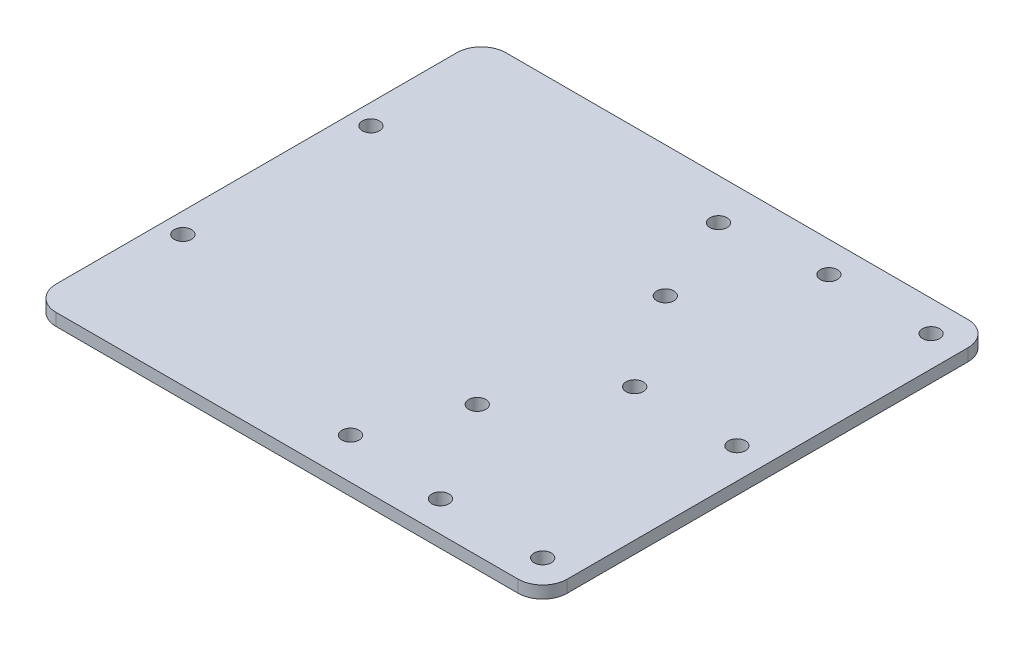
ISO-10303-21;
HEADER;
FILE_DESCRIPTION(('STEP AP214'),'2;1');
FILE_NAME('part.step','',(''),(''),'','','');
FILE_SCHEMA(('AUTOMOTIVE_DESIGN { 1 0 10303 214 1 1 1 1 }'));
ENDSEC;
DATA;
#1=APPLICATION_CONTEXT('core data for automotive mechanical design processes');
#2=APPLICATION_PROTOCOL_DEFINITION('international standard','automotive_design',2000,#1);
#3=PRODUCT_CONTEXT('',#1,'mechanical');
#4=PRODUCT('Part','Part','',(#3));
#5=PRODUCT_RELATED_PRODUCT_CATEGORY('part','',(#4));
#6=PRODUCT_DEFINITION_FORMATION('','',#4);
#7=PRODUCT_DEFINITION_CONTEXT('part definition',#1,'design');
#8=PRODUCT_DEFINITION('design','',#6,#7);
#9=PRODUCT_DEFINITION_SHAPE('','',#8);
#10=(LENGTH_UNIT() NAMED_UNIT(*) SI_UNIT(.MILLI.,.METRE.));
#11=(NAMED_UNIT(*) PLANE_ANGLE_UNIT() SI_UNIT($,.RADIAN.));
#12=(NAMED_UNIT(*) SI_UNIT($,.STERADIAN.) SOLID_ANGLE_UNIT());
#13=UNCERTAINTY_MEASURE_WITH_UNIT(LENGTH_MEASURE(1.E-05),#10,'distance_accuracy_value','');
#14=(GEOMETRIC_REPRESENTATION_CONTEXT(3) GLOBAL_UNCERTAINTY_ASSIGNED_CONTEXT((#13)) GLOBAL_UNIT_ASSIGNED_CONTEXT((#10,
#11,#12)) REPRESENTATION_CONTEXT('',''));
#15=CARTESIAN_POINT('',(0.,0.,0.));
#16=DIRECTION('',(0.,0.,1.));
#17=DIRECTION('',(1.,0.,0.));
#18=AXIS2_PLACEMENT_3D('',#15,#16,#17);
#19=CARTESIAN_POINT('',(9.21175578652743,3.,55.8895277814332));
#20=DIRECTION('',(0.,-1.,0.));
#21=DIRECTION('',(0.,0.,-1.));
#22=AXIS2_PLACEMENT_3D('',#19,#20,#21);
#23=CYLINDRICAL_SURFACE('',#22,6.);
#24=CARTESIAN_POINT('',(9.21175578652743,0.,55.8895277814332));
#25=DIRECTION('',(0.,1.,0.));
#26=DIRECTION('',(0.,0.,-1.));
#27=AXIS2_PLACEMENT_3D('',#24,#25,#26);
#28=CIRCLE('',#27,6.);
#29=CARTESIAN_POINT('',(9.21175578652743,0.,61.8895277814332));
#30=VERTEX_POINT('',#29);
#31=CARTESIAN_POINT('',(15.2117557865274,0.,55.8895277814332));
#32=VERTEX_POINT('',#31);
#33=EDGE_CURVE('E130',#30,#32,#28,.T.);
#34=ORIENTED_EDGE('',*,*,#33,.T.);
#35=DIRECTION('',(0.,-1.,0.));
#36=VECTOR('',#35,1.);
#37=CARTESIAN_POINT('',(15.2117557865274,3.,55.8895277814332));
#38=LINE('',#37,#36);
#39=CARTESIAN_POINT('',(15.2117557865274,3.,55.8895277814332));
#40=VERTEX_POINT('',#39);
#41=EDGE_CURVE('E11',#40,#32,#38,.T.);
#42=ORIENTED_EDGE('',*,*,#41,.F.);
#43=CARTESIAN_POINT('',(9.21175578652743,3.,55.8895277814332));
#44=DIRECTION('',(0.,1.,0.));
#45=DIRECTION('',(0.,0.,-1.));
#46=AXIS2_PLACEMENT_3D('',#43,#44,#45);
#47=CIRCLE('',#46,6.);
#48=CARTESIAN_POINT('',(9.21175578652743,3.,61.8895277814332));
#49=VERTEX_POINT('',#48);
#50=EDGE_CURVE('E145',#49,#40,#47,.T.);
#51=ORIENTED_EDGE('',*,*,#50,.F.);
#52=DIRECTION('',(0.,-1.,0.));
#53=VECTOR('',#52,1.);
#54=CARTESIAN_POINT('',(9.21175578652743,3.,61.8895277814332));
#55=LINE('',#54,#53);
#56=EDGE_CURVE('E126',#49,#30,#55,.T.);
#57=ORIENTED_EDGE('',*,*,#56,.T.);
#58=EDGE_LOOP('',(#34,#42,#51,#57));
#59=FACE_BOUND('',#58,.T.);
#60=ADVANCED_FACE('F34',(#59),#23,.T.);
#61=CARTESIAN_POINT('',(15.2117557865274,3.,55.8895277814332));
#62=DIRECTION('',(-1.,0.,0.));
#63=DIRECTION('',(0.,0.,1.));
#64=AXIS2_PLACEMENT_3D('',#61,#62,#63);
#65=PLANE('',#64);
#66=DIRECTION('',(0.,0.,-1.));
#67=VECTOR('',#66,1.);
#68=CARTESIAN_POINT('',(15.2117557865274,0.,55.8895277814332));
#69=LINE('',#68,#67);
#70=CARTESIAN_POINT('',(15.2117557865274,0.,-42.1104722185669));
#71=VERTEX_POINT('',#70);
#72=EDGE_CURVE('E133',#32,#71,#69,.T.);
#73=ORIENTED_EDGE('',*,*,#72,.T.);
#74=DIRECTION('',(0.,-1.,0.));
#75=VECTOR('',#74,1.);
#76=CARTESIAN_POINT('',(15.2117557865274,3.,-42.1104722185669));
#77=LINE('',#76,#75);
#78=CARTESIAN_POINT('',(15.2117557865274,3.,-42.1104722185669));
#79=VERTEX_POINT('',#78);
#80=EDGE_CURVE('E42',#79,#71,#77,.T.);
#81=ORIENTED_EDGE('',*,*,#80,.F.);
#82=DIRECTION('',(0.,0.,-1.));
#83=VECTOR('',#82,1.);
#84=CARTESIAN_POINT('',(15.2117557865274,3.,55.8895277814332));
#85=LINE('',#84,#83);
#86=EDGE_CURVE('E93',#40,#79,#85,.T.);
#87=ORIENTED_EDGE('',*,*,#86,.F.);
#88=ORIENTED_EDGE('',*,*,#41,.T.);
#89=EDGE_LOOP('',(#73,#81,#87,#88));
#90=FACE_BOUND('',#89,.T.);
#91=ADVANCED_FACE('F301',(#90),#65,.F.);
#92=CARTESIAN_POINT('',(9.21175578652743,3.,-42.1104722185669));
#93=DIRECTION('',(0.,-1.,0.));
#94=DIRECTION('',(0.,0.,-1.));
#95=AXIS2_PLACEMENT_3D('',#92,#93,#94);
#96=CYLINDRICAL_SURFACE('',#95,6.);
#97=CARTESIAN_POINT('',(9.21175578652743,0.,-42.1104722185669));
#98=DIRECTION('',(0.,1.,0.));
#99=DIRECTION('',(0.,0.,1.));
#100=AXIS2_PLACEMENT_3D('',#97,#98,#99);
#101=CIRCLE('',#100,6.);
#102=CARTESIAN_POINT('',(9.21175578652743,0.,-48.1104722185669));
#103=VERTEX_POINT('',#102);
#104=EDGE_CURVE('E136',#71,#103,#101,.T.);
#105=ORIENTED_EDGE('',*,*,#104,.T.);
#106=DIRECTION('',(0.,-1.,0.));
#107=VECTOR('',#106,1.);
#108=CARTESIAN_POINT('',(9.21175578652743,3.,-48.1104722185669));
#109=LINE('',#108,#107);
#110=CARTESIAN_POINT('',(9.21175578652743,3.,-48.1104722185669));
#111=VERTEX_POINT('',#110);
#112=EDGE_CURVE('E152',#111,#103,#109,.T.);
#113=ORIENTED_EDGE('',*,*,#112,.F.);
#114=CARTESIAN_POINT('',(9.21175578652743,3.,-42.1104722185669));
#115=DIRECTION('',(0.,1.,0.));
#116=DIRECTION('',(0.,0.,1.));
#117=AXIS2_PLACEMENT_3D('',#114,#115,#116);
#118=CIRCLE('',#117,6.);
#119=EDGE_CURVE('E160',#79,#111,#118,.T.);
#120=ORIENTED_EDGE('',*,*,#119,.F.);
#121=ORIENTED_EDGE('',*,*,#80,.T.);
#122=EDGE_LOOP('',(#105,#113,#120,#121));
#123=FACE_BOUND('',#122,.T.);
#124=ADVANCED_FACE('F158',(#123),#96,.T.);
#125=CARTESIAN_POINT('',(9.21175578652743,3.,-48.1104722185669));
#126=DIRECTION('',(0.,0.,1.));
#127=DIRECTION('',(1.,0.,0.));
#128=AXIS2_PLACEMENT_3D('',#125,#126,#127);
#129=PLANE('',#128);
#130=DIRECTION('',(-1.,0.,0.));
#131=VECTOR('',#130,1.);
#132=CARTESIAN_POINT('',(9.21175578652743,0.,-48.1104722185669));
#133=LINE('',#132,#131);
#134=CARTESIAN_POINT('',(-103.788244213473,0.,-48.1104722185668));
#135=VERTEX_POINT('',#134);
#136=EDGE_CURVE('E138',#103,#135,#133,.T.);
#137=ORIENTED_EDGE('',*,*,#136,.T.);
#138=DIRECTION('',(0.,-1.,0.));
#139=VECTOR('',#138,1.);
#140=CARTESIAN_POINT('',(-103.788244213473,3.,-48.1104722185668));
#141=LINE('',#140,#139);
#142=CARTESIAN_POINT('',(-103.788244213473,3.,-48.1104722185668));
#143=VERTEX_POINT('',#142);
#144=EDGE_CURVE('E149',#143,#135,#141,.T.);
#145=ORIENTED_EDGE('',*,*,#144,.F.);
#146=DIRECTION('',(-1.,0.,0.));
#147=VECTOR('',#146,1.);
#148=CARTESIAN_POINT('',(9.21175578652743,3.,-48.1104722185669));
#149=LINE('',#148,#147);
#150=EDGE_CURVE('E172',#111,#143,#149,.T.);
#151=ORIENTED_EDGE('',*,*,#150,.F.);
#152=ORIENTED_EDGE('',*,*,#112,.T.);
#153=EDGE_LOOP('',(#137,#145,#151,#152));
#154=FACE_BOUND('',#153,.T.);
#155=ADVANCED_FACE('F168',(#154),#129,.F.);
#156=CARTESIAN_POINT('',(-103.788244213473,3.,-42.1104722185668));
#157=DIRECTION('',(0.,-1.,0.));
#158=DIRECTION('',(0.,0.,-1.));
#159=AXIS2_PLACEMENT_3D('',#156,#157,#158);
#160=CYLINDRICAL_SURFACE('',#159,6.00000000000001);
#161=CARTESIAN_POINT('',(-103.788244213473,0.,-42.1104722185668));
#162=DIRECTION('',(0.,1.,0.));
#163=DIRECTION('',(0.,0.,1.));
#164=AXIS2_PLACEMENT_3D('',#161,#162,#163);
#165=CIRCLE('',#164,6.00000000000001);
#166=CARTESIAN_POINT('',(-109.788244213473,0.,-42.1104722185668));
#167=VERTEX_POINT('',#166);
#168=EDGE_CURVE('E140',#135,#167,#165,.T.);
#169=ORIENTED_EDGE('',*,*,#168,.T.);
#170=DIRECTION('',(0.,-1.,0.));
#171=VECTOR('',#170,1.);
#172=CARTESIAN_POINT('',(-109.788244213473,3.,-42.1104722185668));
#173=LINE('',#172,#171);
#174=CARTESIAN_POINT('',(-109.788244213473,3.,-42.1104722185668));
#175=VERTEX_POINT('',#174);
#176=EDGE_CURVE('E121',#175,#167,#173,.T.);
#177=ORIENTED_EDGE('',*,*,#176,.F.);
#178=CARTESIAN_POINT('',(-103.788244213473,3.,-42.1104722185668));
#179=DIRECTION('',(0.,1.,0.));
#180=DIRECTION('',(0.,0.,1.));
#181=AXIS2_PLACEMENT_3D('',#178,#179,#180);
#182=CIRCLE('',#181,6.00000000000001);
#183=EDGE_CURVE('E112',#143,#175,#182,.T.);
#184=ORIENTED_EDGE('',*,*,#183,.F.);
#185=ORIENTED_EDGE('',*,*,#144,.T.);
#186=EDGE_LOOP('',(#169,#177,#184,#185));
#187=FACE_BOUND('',#186,.T.);
#188=ADVANCED_FACE('F171',(#187),#160,.T.);
#189=CARTESIAN_POINT('',(-109.788244213473,3.,-42.1104722185668));
#190=DIRECTION('',(1.,0.,0.));
#191=DIRECTION('',(0.,0.,-1.));
#192=AXIS2_PLACEMENT_3D('',#189,#190,#191);
#193=PLANE('',#192);
#194=DIRECTION('',(0.,0.,1.));
#195=VECTOR('',#194,1.);
#196=CARTESIAN_POINT('',(-109.788244213473,0.,-42.1104722185668));
#197=LINE('',#196,#195);
#198=CARTESIAN_POINT('',(-109.788244213473,0.,55.8895277814332));
#199=VERTEX_POINT('',#198);
#200=EDGE_CURVE('E120',#167,#199,#197,.T.);
#201=ORIENTED_EDGE('',*,*,#200,.T.);
#202=DIRECTION('',(0.,-1.,0.));
#203=VECTOR('',#202,1.);
#204=CARTESIAN_POINT('',(-109.788244213473,3.,55.8895277814332));
#205=LINE('',#204,#203);
#206=CARTESIAN_POINT('',(-109.788244213473,3.,55.8895277814332));
#207=VERTEX_POINT('',#206);
#208=EDGE_CURVE('E117',#207,#199,#205,.T.);
#209=ORIENTED_EDGE('',*,*,#208,.F.);
#210=DIRECTION('',(0.,0.,1.));
#211=VECTOR('',#210,1.);
#212=CARTESIAN_POINT('',(-109.788244213473,3.,-42.1104722185668));
#213=LINE('',#212,#211);
#214=EDGE_CURVE('E106',#175,#207,#213,.T.);
#215=ORIENTED_EDGE('',*,*,#214,.F.);
#216=ORIENTED_EDGE('',*,*,#176,.T.);
#217=EDGE_LOOP('',(#201,#209,#215,#216));
#218=FACE_BOUND('',#217,.T.);
#219=ADVANCED_FACE('F118',(#218),#193,.F.);
#220=CARTESIAN_POINT('',(-103.788244213473,3.,55.8895277814332));
#221=DIRECTION('',(0.,-1.,0.));
#222=DIRECTION('',(0.,0.,-1.));
#223=AXIS2_PLACEMENT_3D('',#220,#221,#222);
#224=CYLINDRICAL_SURFACE('',#223,6.);
#225=CARTESIAN_POINT('',(-103.788244213473,0.,55.8895277814332));
#226=DIRECTION('',(0.,1.,0.));
#227=DIRECTION('',(0.,0.,-1.));
#228=AXIS2_PLACEMENT_3D('',#225,#226,#227);
#229=CIRCLE('',#228,6.);
#230=CARTESIAN_POINT('',(-103.788244213473,0.,61.8895277814332));
#231=VERTEX_POINT('',#230);
#232=EDGE_CURVE('E79',#199,#231,#229,.T.);
#233=ORIENTED_EDGE('',*,*,#232,.T.);
#234=DIRECTION('',(0.,-1.,0.));
#235=VECTOR('',#234,1.);
#236=CARTESIAN_POINT('',(-103.788244213473,3.,61.8895277814332));
#237=LINE('',#236,#235);
#238=CARTESIAN_POINT('',(-103.788244213473,3.,61.8895277814332));
#239=VERTEX_POINT('',#238);
#240=EDGE_CURVE('E122',#239,#231,#237,.T.);
#241=ORIENTED_EDGE('',*,*,#240,.F.);
#242=CARTESIAN_POINT('',(-103.788244213473,3.,55.8895277814332));
#243=DIRECTION('',(0.,1.,0.));
#244=DIRECTION('',(0.,0.,-1.));
#245=AXIS2_PLACEMENT_3D('',#242,#243,#244);
#246=CIRCLE('',#245,6.);
#247=EDGE_CURVE('E110',#207,#239,#246,.T.);
#248=ORIENTED_EDGE('',*,*,#247,.F.);
#249=ORIENTED_EDGE('',*,*,#208,.T.);
#250=EDGE_LOOP('',(#233,#241,#248,#249));
#251=FACE_BOUND('',#250,.T.);
#252=ADVANCED_FACE('F124',(#251),#224,.T.);
#253=CARTESIAN_POINT('',(-103.788244213473,3.,61.8895277814332));
#254=DIRECTION('',(0.,0.,-1.));
#255=DIRECTION('',(-1.,0.,0.));
#256=AXIS2_PLACEMENT_3D('',#253,#254,#255);
#257=PLANE('',#256);
#258=DIRECTION('',(1.,0.,0.));
#259=VECTOR('',#258,1.);
#260=CARTESIAN_POINT('',(-103.788244213473,0.,61.8895277814332));
#261=LINE('',#260,#259);
#262=EDGE_CURVE('E85',#231,#30,#261,.T.);
#263=ORIENTED_EDGE('',*,*,#262,.T.);
#264=ORIENTED_EDGE('',*,*,#56,.F.);
#265=DIRECTION('',(1.,0.,0.));
#266=VECTOR('',#265,1.);
#267=CARTESIAN_POINT('',(-103.788244213473,3.,61.8895277814332));
#268=LINE('',#267,#266);
#269=EDGE_CURVE('E50',#239,#49,#268,.T.);
#270=ORIENTED_EDGE('',*,*,#269,.F.);
#271=ORIENTED_EDGE('',*,*,#240,.T.);
#272=EDGE_LOOP('',(#263,#264,#270,#271));
#273=FACE_BOUND('',#272,.T.);
#274=ADVANCED_FACE('F261',(#273),#257,.F.);
#275=CARTESIAN_POINT('',(9.21175578652743,3.,55.8895277814332));
#276=DIRECTION('',(0.,-1.,0.));
#277=DIRECTION('',(0.,0.,-1.));
#278=AXIS2_PLACEMENT_3D('',#275,#276,#277);
#279=PLANE('',#278);
#280=CARTESIAN_POINT('',(-41.7882442134725,3.,51.8895277814332));
#281=DIRECTION('',(0.,-1.,0.));
#282=DIRECTION('',(0.,0.,-1.));
#283=AXIS2_PLACEMENT_3D('',#280,#281,#282);
#284=CIRCLE('',#283,2.1);
#285=CARTESIAN_POINT('',(-41.7882442134725,3.,49.7895277814332));
#286=VERTEX_POINT('',#285);
#287=EDGE_CURVE('E224',#286,#286,#284,.T.);
#288=ORIENTED_EDGE('',*,*,#287,.T.);
#289=EDGE_LOOP('',(#288));
#290=FACE_BOUND('',#289,.T.);
#291=CARTESIAN_POINT('',(-41.7882442134726,3.,-38.1104722185668));
#292=DIRECTION('',(0.,-1.,0.));
#293=DIRECTION('',(0.,0.,-1.));
#294=AXIS2_PLACEMENT_3D('',#291,#292,#293);
#295=CIRCLE('',#294,2.1);
#296=CARTESIAN_POINT('',(-41.7882442134726,3.,-40.2104722185668));
#297=VERTEX_POINT('',#296);
#298=EDGE_CURVE('E240',#297,#297,#295,.T.);
#299=ORIENTED_EDGE('',*,*,#298,.T.);
#300=EDGE_LOOP('',(#299));
#301=FACE_BOUND('',#300,.T.);
#302=CARTESIAN_POINT('',(-32.7882442134726,3.,29.8895277814332));
#303=DIRECTION('',(0.,1.,0.));
#304=DIRECTION('',(0.,0.,1.));
#305=AXIS2_PLACEMENT_3D('',#302,#303,#304);
#306=CIRCLE('',#305,2.1);
#307=CARTESIAN_POINT('',(-32.7882442134726,3.,31.9895277814332));
#308=VERTEX_POINT('',#307);
#309=EDGE_CURVE('E220',#308,#308,#306,.T.);
#310=ORIENTED_EDGE('',*,*,#309,.F.);
#311=EDGE_LOOP('',(#310));
#312=FACE_BOUND('',#311,.T.);
#313=CARTESIAN_POINT('',(-32.7882442134726,3.,-16.1104722185668));
#314=DIRECTION('',(0.,1.,0.));
#315=DIRECTION('',(0.,0.,1.));
#316=AXIS2_PLACEMENT_3D('',#313,#314,#315);
#317=CIRCLE('',#316,2.1);
#318=CARTESIAN_POINT('',(-32.7882442134726,3.,-14.0104722185668));
#319=VERTEX_POINT('',#318);
#320=EDGE_CURVE('E227',#319,#319,#317,.T.);
#321=ORIENTED_EDGE('',*,*,#320,.F.);
#322=EDGE_LOOP('',(#321));
#323=FACE_BOUND('',#322,.T.);
#324=CARTESIAN_POINT('',(-104.788244213473,3.,-16.1104722185668));
#325=DIRECTION('',(0.,1.,0.));
#326=DIRECTION('',(0.,0.,1.));
#327=AXIS2_PLACEMENT_3D('',#324,#325,#326);
#328=CIRCLE('',#327,2.1);
#329=CARTESIAN_POINT('',(-104.788244213473,3.,-14.0104722185668));
#330=VERTEX_POINT('',#329);
#331=EDGE_CURVE('E233',#330,#330,#328,.T.);
#332=ORIENTED_EDGE('',*,*,#331,.F.);
#333=EDGE_LOOP('',(#332));
#334=FACE_BOUND('',#333,.T.);
#335=CARTESIAN_POINT('',(-104.788244213473,3.,29.8895277814332));
#336=DIRECTION('',(0.,1.,0.));
#337=DIRECTION('',(0.,0.,1.));
#338=AXIS2_PLACEMENT_3D('',#335,#336,#337);
#339=CIRCLE('',#338,2.1);
#340=CARTESIAN_POINT('',(-104.788244213473,3.,31.9895277814332));
#341=VERTEX_POINT('',#340);
#342=EDGE_CURVE('E214',#341,#341,#339,.T.);
#343=ORIENTED_EDGE('',*,*,#342,.F.);
#344=EDGE_LOOP('',(#343));
#345=FACE_BOUND('',#344,.T.);
#346=CARTESIAN_POINT('',(-17.2882442134729,3.,-40.6104722185853));
#347=DIRECTION('',(0.,1.,0.));
#348=DIRECTION('',(0.,0.,1.));
#349=AXIS2_PLACEMENT_3D('',#346,#347,#348);
#350=CIRCLE('',#349,2.1);
#351=CARTESIAN_POINT('',(-17.2882442134729,3.,-38.5104722185853));
#352=VERTEX_POINT('',#351);
#353=EDGE_CURVE('E196',#352,#352,#350,.T.);
#354=ORIENTED_EDGE('',*,*,#353,.F.);
#355=EDGE_LOOP('',(#354));
#356=FACE_BOUND('',#355,.T.);
#357=CARTESIAN_POINT('',(7.71175578652728,3.,6.88952778141466));
#358=DIRECTION('',(0.,1.,0.));
#359=DIRECTION('',(0.,0.,1.));
#360=AXIS2_PLACEMENT_3D('',#357,#358,#359);
#361=CIRCLE('',#360,2.1);
#362=CARTESIAN_POINT('',(7.71175578652728,3.,8.98952778141466));
#363=VERTEX_POINT('',#362);
#364=EDGE_CURVE('E203',#363,#363,#361,.T.);
#365=ORIENTED_EDGE('',*,*,#364,.F.);
#366=EDGE_LOOP('',(#365));
#367=FACE_BOUND('',#366,.T.);
#368=CARTESIAN_POINT('',(-17.2882442134727,3.,6.88952778141466));
#369=DIRECTION('',(0.,1.,0.));
#370=DIRECTION('',(0.,0.,1.));
#371=AXIS2_PLACEMENT_3D('',#368,#369,#370);
#372=CIRCLE('',#371,2.1);
#373=CARTESIAN_POINT('',(-17.2882442134727,3.,8.98952778141466));
#374=VERTEX_POINT('',#373);
#375=EDGE_CURVE('E184',#374,#374,#372,.T.);
#376=ORIENTED_EDGE('',*,*,#375,.F.);
#377=EDGE_LOOP('',(#376));
#378=FACE_BOUND('',#377,.T.);
#379=CARTESIAN_POINT('',(7.71175578652745,3.,54.3895277814147));
#380=DIRECTION('',(0.,1.,0.));
#381=DIRECTION('',(0.,0.,1.));
#382=AXIS2_PLACEMENT_3D('',#379,#380,#381);
#383=CIRCLE('',#382,2.1);
#384=CARTESIAN_POINT('',(7.71175578652745,3.,56.4895277814147));
#385=VERTEX_POINT('',#384);
#386=EDGE_CURVE('E191',#385,#385,#383,.T.);
#387=ORIENTED_EDGE('',*,*,#386,.F.);
#388=EDGE_LOOP('',(#387));
#389=FACE_BOUND('',#388,.T.);
#390=CARTESIAN_POINT('',(7.71175578652712,3.,-40.6104722185853));
#391=DIRECTION('',(0.,1.,0.));
#392=DIRECTION('',(0.,0.,1.));
#393=AXIS2_PLACEMENT_3D('',#390,#391,#392);
#394=CIRCLE('',#393,2.1);
#395=CARTESIAN_POINT('',(7.71175578652712,3.,-38.5104722185853));
#396=VERTEX_POINT('',#395);
#397=EDGE_CURVE('E208',#396,#396,#394,.T.);
#398=ORIENTED_EDGE('',*,*,#397,.F.);
#399=EDGE_LOOP('',(#398));
#400=FACE_BOUND('',#399,.T.);
#401=CARTESIAN_POINT('',(-17.2882442134726,3.,54.3895277814147));
#402=DIRECTION('',(0.,1.,0.));
#403=DIRECTION('',(0.,0.,1.));
#404=AXIS2_PLACEMENT_3D('',#401,#402,#403);
#405=CIRCLE('',#404,2.1);
#406=CARTESIAN_POINT('',(-17.2882442134726,3.,56.4895277814147));
#407=VERTEX_POINT('',#406);
#408=EDGE_CURVE('E178',#407,#407,#405,.T.);
#409=ORIENTED_EDGE('',*,*,#408,.F.);
#410=EDGE_LOOP('',(#409));
#411=FACE_BOUND('',#410,.T.);
#412=ORIENTED_EDGE('',*,*,#50,.T.);
#413=ORIENTED_EDGE('',*,*,#86,.T.);
#414=ORIENTED_EDGE('',*,*,#119,.T.);
#415=ORIENTED_EDGE('',*,*,#150,.T.);
#416=ORIENTED_EDGE('',*,*,#183,.T.);
#417=ORIENTED_EDGE('',*,*,#214,.T.);
#418=ORIENTED_EDGE('',*,*,#247,.T.);
#419=ORIENTED_EDGE('',*,*,#269,.T.);
#420=EDGE_LOOP('',(#412,#413,#414,#415,#416,#417,#418,#419));
#421=FACE_BOUND('',#420,.T.);
#422=ADVANCED_FACE('F108',(#290,#301,#312,#323,#334,#345,#356,#367,#378,#389,#400,#411,#421),
#279,.F.);
#423=CARTESIAN_POINT('',(9.21175578652743,0.,55.8895277814332));
#424=DIRECTION('',(0.,-1.,0.));
#425=DIRECTION('',(0.,0.,-1.));
#426=AXIS2_PLACEMENT_3D('',#423,#424,#425);
#427=PLANE('',#426);
#428=CARTESIAN_POINT('',(-41.7882442134725,0.,51.8895277814332));
#429=DIRECTION('',(0.,1.,0.));
#430=DIRECTION('',(0.,0.,1.));
#431=AXIS2_PLACEMENT_3D('',#428,#429,#430);
#432=CIRCLE('',#431,2.1);
#433=CARTESIAN_POINT('',(-41.7882442134725,0.,53.9895277814332));
#434=VERTEX_POINT('',#433);
#435=EDGE_CURVE('E243',#434,#434,#432,.T.);
#436=ORIENTED_EDGE('',*,*,#435,.T.);
#437=EDGE_LOOP('',(#436));
#438=FACE_BOUND('',#437,.T.);
#439=CARTESIAN_POINT('',(-41.7882442134726,0.,-38.1104722185668));
#440=DIRECTION('',(0.,1.,0.));
#441=DIRECTION('',(0.,0.,1.));
#442=AXIS2_PLACEMENT_3D('',#439,#440,#441);
#443=CIRCLE('',#442,2.1);
#444=CARTESIAN_POINT('',(-41.7882442134726,0.,-36.0104722185668));
#445=VERTEX_POINT('',#444);
#446=EDGE_CURVE('E244',#445,#445,#443,.T.);
#447=ORIENTED_EDGE('',*,*,#446,.T.);
#448=EDGE_LOOP('',(#447));
#449=FACE_BOUND('',#448,.T.);
#450=CARTESIAN_POINT('',(-32.7882442134726,0.,29.8895277814332));
#451=DIRECTION('',(0.,1.,0.));
#452=DIRECTION('',(0.,0.,1.));
#453=AXIS2_PLACEMENT_3D('',#450,#451,#452);
#454=CIRCLE('',#453,2.1);
#455=CARTESIAN_POINT('',(-32.7882442134726,0.,31.9895277814332));
#456=VERTEX_POINT('',#455);
#457=EDGE_CURVE('E223',#456,#456,#454,.T.);
#458=ORIENTED_EDGE('',*,*,#457,.T.);
#459=EDGE_LOOP('',(#458));
#460=FACE_BOUND('',#459,.T.);
#461=CARTESIAN_POINT('',(-32.7882442134726,0.,-16.1104722185668));
#462=DIRECTION('',(0.,1.,0.));
#463=DIRECTION('',(0.,0.,1.));
#464=AXIS2_PLACEMENT_3D('',#461,#462,#463);
#465=CIRCLE('',#464,2.1);
#466=CARTESIAN_POINT('',(-32.7882442134726,0.,-14.0104722185668));
#467=VERTEX_POINT('',#466);
#468=EDGE_CURVE('E230',#467,#467,#465,.T.);
#469=ORIENTED_EDGE('',*,*,#468,.T.);
#470=EDGE_LOOP('',(#469));
#471=FACE_BOUND('',#470,.T.);
#472=CARTESIAN_POINT('',(-104.788244213473,0.,-16.1104722185668));
#473=DIRECTION('',(0.,1.,0.));
#474=DIRECTION('',(0.,0.,1.));
#475=AXIS2_PLACEMENT_3D('',#472,#473,#474);
#476=CIRCLE('',#475,2.1);
#477=CARTESIAN_POINT('',(-104.788244213473,0.,-14.0104722185668));
#478=VERTEX_POINT('',#477);
#479=EDGE_CURVE('E217',#478,#478,#476,.T.);
#480=ORIENTED_EDGE('',*,*,#479,.T.);
#481=EDGE_LOOP('',(#480));
#482=FACE_BOUND('',#481,.T.);
#483=CARTESIAN_POINT('',(-104.788244213473,0.,29.8895277814332));
#484=DIRECTION('',(0.,1.,0.));
#485=DIRECTION('',(0.,0.,1.));
#486=AXIS2_PLACEMENT_3D('',#483,#484,#485);
#487=CIRCLE('',#486,2.1);
#488=CARTESIAN_POINT('',(-104.788244213473,0.,31.9895277814332));
#489=VERTEX_POINT('',#488);
#490=EDGE_CURVE('E211',#489,#489,#487,.T.);
#491=ORIENTED_EDGE('',*,*,#490,.T.);
#492=EDGE_LOOP('',(#491));
#493=FACE_BOUND('',#492,.T.);
#494=CARTESIAN_POINT('',(-17.2882442134729,0.,-40.6104722185853));
#495=DIRECTION('',(0.,1.,0.));
#496=DIRECTION('',(0.,0.,1.));
#497=AXIS2_PLACEMENT_3D('',#494,#495,#496);
#498=CIRCLE('',#497,2.1);
#499=CARTESIAN_POINT('',(-17.2882442134729,0.,-38.5104722185853));
#500=VERTEX_POINT('',#499);
#501=EDGE_CURVE('E199',#500,#500,#498,.T.);
#502=ORIENTED_EDGE('',*,*,#501,.T.);
#503=EDGE_LOOP('',(#502));
#504=FACE_BOUND('',#503,.T.);
#505=CARTESIAN_POINT('',(7.71175578652728,0.,6.88952778141466));
#506=DIRECTION('',(0.,1.,0.));
#507=DIRECTION('',(0.,0.,1.));
#508=AXIS2_PLACEMENT_3D('',#505,#506,#507);
#509=CIRCLE('',#508,2.1);
#510=CARTESIAN_POINT('',(7.71175578652728,0.,8.98952778141466));
#511=VERTEX_POINT('',#510);
#512=EDGE_CURVE('E188',#511,#511,#509,.T.);
#513=ORIENTED_EDGE('',*,*,#512,.T.);
#514=EDGE_LOOP('',(#513));
#515=FACE_BOUND('',#514,.T.);
#516=CARTESIAN_POINT('',(-17.2882442134727,0.,6.88952778141466));
#517=DIRECTION('',(0.,1.,0.));
#518=DIRECTION('',(0.,0.,1.));
#519=AXIS2_PLACEMENT_3D('',#516,#517,#518);
#520=CIRCLE('',#519,2.1);
#521=CARTESIAN_POINT('',(-17.2882442134727,0.,8.98952778141466));
#522=VERTEX_POINT('',#521);
#523=EDGE_CURVE('E187',#522,#522,#520,.T.);
#524=ORIENTED_EDGE('',*,*,#523,.T.);
#525=EDGE_LOOP('',(#524));
#526=FACE_BOUND('',#525,.T.);
#527=CARTESIAN_POINT('',(7.71175578652745,0.,54.3895277814147));
#528=DIRECTION('',(0.,1.,0.));
#529=DIRECTION('',(0.,0.,1.));
#530=AXIS2_PLACEMENT_3D('',#527,#528,#529);
#531=CIRCLE('',#530,2.1);
#532=CARTESIAN_POINT('',(7.71175578652745,0.,56.4895277814147));
#533=VERTEX_POINT('',#532);
#534=EDGE_CURVE('E181',#533,#533,#531,.T.);
#535=ORIENTED_EDGE('',*,*,#534,.T.);
#536=EDGE_LOOP('',(#535));
#537=FACE_BOUND('',#536,.T.);
#538=CARTESIAN_POINT('',(7.71175578652712,0.,-40.6104722185853));
#539=DIRECTION('',(0.,1.,0.));
#540=DIRECTION('',(0.,0.,1.));
#541=AXIS2_PLACEMENT_3D('',#538,#539,#540);
#542=CIRCLE('',#541,2.1);
#543=CARTESIAN_POINT('',(7.71175578652712,0.,-38.5104722185853));
#544=VERTEX_POINT('',#543);
#545=EDGE_CURVE('E200',#544,#544,#542,.T.);
#546=ORIENTED_EDGE('',*,*,#545,.T.);
#547=EDGE_LOOP('',(#546));
#548=FACE_BOUND('',#547,.T.);
#549=CARTESIAN_POINT('',(-17.2882442134726,0.,54.3895277814147));
#550=DIRECTION('',(0.,1.,0.));
#551=DIRECTION('',(0.,0.,1.));
#552=AXIS2_PLACEMENT_3D('',#549,#550,#551);
#553=CIRCLE('',#552,2.1);
#554=CARTESIAN_POINT('',(-17.2882442134726,0.,56.4895277814147));
#555=VERTEX_POINT('',#554);
#556=EDGE_CURVE('E134',#555,#555,#553,.T.);
#557=ORIENTED_EDGE('',*,*,#556,.T.);
#558=EDGE_LOOP('',(#557));
#559=FACE_BOUND('',#558,.T.);
#560=ORIENTED_EDGE('',*,*,#33,.F.);
#561=ORIENTED_EDGE('',*,*,#262,.F.);
#562=ORIENTED_EDGE('',*,*,#232,.F.);
#563=ORIENTED_EDGE('',*,*,#200,.F.);
#564=ORIENTED_EDGE('',*,*,#168,.F.);
#565=ORIENTED_EDGE('',*,*,#136,.F.);
#566=ORIENTED_EDGE('',*,*,#104,.F.);
#567=ORIENTED_EDGE('',*,*,#72,.F.);
#568=EDGE_LOOP('',(#560,#561,#562,#563,#564,#565,#566,#567));
#569=FACE_BOUND('',#568,.T.);
#570=ADVANCED_FACE('F164',(#438,#449,#460,#471,#482,#493,#504,#515,#526,#537,#548,#559,#569),
#427,.T.);
#571=CARTESIAN_POINT('',(-17.2882442134726,0.,54.3895277814147));
#572=DIRECTION('',(0.,1.,0.));
#573=DIRECTION('',(0.,0.,1.));
#574=AXIS2_PLACEMENT_3D('',#571,#572,#573);
#575=CYLINDRICAL_SURFACE('',#574,2.1);
#576=ORIENTED_EDGE('',*,*,#556,.F.);
#577=EDGE_LOOP('',(#576));
#578=FACE_BOUND('',#577,.T.);
#579=ORIENTED_EDGE('',*,*,#408,.T.);
#580=EDGE_LOOP('',(#579));
#581=FACE_BOUND('',#580,.T.);
#582=ADVANCED_FACE('F285',(#578,#581),#575,.F.);
#583=CARTESIAN_POINT('',(7.71175578652712,0.,-40.6104722185853));
#584=DIRECTION('',(0.,1.,0.));
#585=DIRECTION('',(0.,0.,1.));
#586=AXIS2_PLACEMENT_3D('',#583,#584,#585);
#587=CYLINDRICAL_SURFACE('',#586,2.1);
#588=ORIENTED_EDGE('',*,*,#545,.F.);
#589=EDGE_LOOP('',(#588));
#590=FACE_BOUND('',#589,.T.);
#591=ORIENTED_EDGE('',*,*,#397,.T.);
#592=EDGE_LOOP('',(#591));
#593=FACE_BOUND('',#592,.T.);
#594=ADVANCED_FACE('F287',(#590,#593),#587,.F.);
#595=CARTESIAN_POINT('',(7.71175578652745,0.,54.3895277814147));
#596=DIRECTION('',(0.,1.,0.));
#597=DIRECTION('',(0.,0.,1.));
#598=AXIS2_PLACEMENT_3D('',#595,#596,#597);
#599=CYLINDRICAL_SURFACE('',#598,2.1);
#600=ORIENTED_EDGE('',*,*,#534,.F.);
#601=EDGE_LOOP('',(#600));
#602=FACE_BOUND('',#601,.T.);
#603=ORIENTED_EDGE('',*,*,#386,.T.);
#604=EDGE_LOOP('',(#603));
#605=FACE_BOUND('',#604,.T.);
#606=ADVANCED_FACE('F294',(#602,#605),#599,.F.);
#607=CARTESIAN_POINT('',(-17.2882442134727,0.,6.88952778141466));
#608=DIRECTION('',(0.,1.,0.));
#609=DIRECTION('',(0.,0.,1.));
#610=AXIS2_PLACEMENT_3D('',#607,#608,#609);
#611=CYLINDRICAL_SURFACE('',#610,2.1);
#612=ORIENTED_EDGE('',*,*,#523,.F.);
#613=EDGE_LOOP('',(#612));
#614=FACE_BOUND('',#613,.T.);
#615=ORIENTED_EDGE('',*,*,#375,.T.);
#616=EDGE_LOOP('',(#615));
#617=FACE_BOUND('',#616,.T.);
#618=ADVANCED_FACE('F367',(#614,#617),#611,.F.);
#619=CARTESIAN_POINT('',(7.71175578652728,0.,6.88952778141466));
#620=DIRECTION('',(0.,1.,0.));
#621=DIRECTION('',(0.,0.,1.));
#622=AXIS2_PLACEMENT_3D('',#619,#620,#621);
#623=CYLINDRICAL_SURFACE('',#622,2.1);
#624=ORIENTED_EDGE('',*,*,#512,.F.);
#625=EDGE_LOOP('',(#624));
#626=FACE_BOUND('',#625,.T.);
#627=ORIENTED_EDGE('',*,*,#364,.T.);
#628=EDGE_LOOP('',(#627));
#629=FACE_BOUND('',#628,.T.);
#630=ADVANCED_FACE('F377',(#626,#629),#623,.F.);
#631=CARTESIAN_POINT('',(-17.2882442134729,0.,-40.6104722185853));
#632=DIRECTION('',(0.,1.,0.));
#633=DIRECTION('',(0.,0.,1.));
#634=AXIS2_PLACEMENT_3D('',#631,#632,#633);
#635=CYLINDRICAL_SURFACE('',#634,2.1);
#636=ORIENTED_EDGE('',*,*,#501,.F.);
#637=EDGE_LOOP('',(#636));
#638=FACE_BOUND('',#637,.T.);
#639=ORIENTED_EDGE('',*,*,#353,.T.);
#640=EDGE_LOOP('',(#639));
#641=FACE_BOUND('',#640,.T.);
#642=ADVANCED_FACE('F386',(#638,#641),#635,.F.);
#643=CARTESIAN_POINT('',(-104.788244213473,0.,29.8895277814332));
#644=DIRECTION('',(0.,1.,0.));
#645=DIRECTION('',(0.,0.,1.));
#646=AXIS2_PLACEMENT_3D('',#643,#644,#645);
#647=CYLINDRICAL_SURFACE('',#646,2.1);
#648=ORIENTED_EDGE('',*,*,#490,.F.);
#649=EDGE_LOOP('',(#648));
#650=FACE_BOUND('',#649,.T.);
#651=ORIENTED_EDGE('',*,*,#342,.T.);
#652=EDGE_LOOP('',(#651));
#653=FACE_BOUND('',#652,.T.);
#654=ADVANCED_FACE('F396',(#650,#653),#647,.F.);
#655=CARTESIAN_POINT('',(-104.788244213473,0.,-16.1104722185668));
#656=DIRECTION('',(0.,1.,0.));
#657=DIRECTION('',(0.,0.,1.));
#658=AXIS2_PLACEMENT_3D('',#655,#656,#657);
#659=CYLINDRICAL_SURFACE('',#658,2.1);
#660=ORIENTED_EDGE('',*,*,#479,.F.);
#661=EDGE_LOOP('',(#660));
#662=FACE_BOUND('',#661,.T.);
#663=ORIENTED_EDGE('',*,*,#331,.T.);
#664=EDGE_LOOP('',(#663));
#665=FACE_BOUND('',#664,.T.);
#666=ADVANCED_FACE('F406',(#662,#665),#659,.F.);
#667=CARTESIAN_POINT('',(-32.7882442134726,0.,-16.1104722185668));
#668=DIRECTION('',(0.,1.,0.));
#669=DIRECTION('',(0.,0.,1.));
#670=AXIS2_PLACEMENT_3D('',#667,#668,#669);
#671=CYLINDRICAL_SURFACE('',#670,2.1);
#672=ORIENTED_EDGE('',*,*,#468,.F.);
#673=EDGE_LOOP('',(#672));
#674=FACE_BOUND('',#673,.T.);
#675=ORIENTED_EDGE('',*,*,#320,.T.);
#676=EDGE_LOOP('',(#675));
#677=FACE_BOUND('',#676,.T.);
#678=ADVANCED_FACE('F416',(#674,#677),#671,.F.);
#679=CARTESIAN_POINT('',(-32.7882442134726,0.,29.8895277814332));
#680=DIRECTION('',(0.,1.,0.));
#681=DIRECTION('',(0.,0.,1.));
#682=AXIS2_PLACEMENT_3D('',#679,#680,#681);
#683=CYLINDRICAL_SURFACE('',#682,2.1);
#684=ORIENTED_EDGE('',*,*,#457,.F.);
#685=EDGE_LOOP('',(#684));
#686=FACE_BOUND('',#685,.T.);
#687=ORIENTED_EDGE('',*,*,#309,.T.);
#688=EDGE_LOOP('',(#687));
#689=FACE_BOUND('',#688,.T.);
#690=ADVANCED_FACE('F426',(#686,#689),#683,.F.);
#691=CARTESIAN_POINT('',(-41.7882442134726,0.,-38.1104722185668));
#692=DIRECTION('',(0.,1.,0.));
#693=DIRECTION('',(0.,0.,1.));
#694=AXIS2_PLACEMENT_3D('',#691,#692,#693);
#695=CYLINDRICAL_SURFACE('',#694,2.1);
#696=ORIENTED_EDGE('',*,*,#446,.F.);
#697=EDGE_LOOP('',(#696));
#698=FACE_BOUND('',#697,.T.);
#699=ORIENTED_EDGE('',*,*,#298,.F.);
#700=EDGE_LOOP('',(#699));
#701=FACE_BOUND('',#700,.T.);
#702=ADVANCED_FACE('F255',(#698,#701),#695,.F.);
#703=CARTESIAN_POINT('',(-41.7882442134725,0.,51.8895277814332));
#704=DIRECTION('',(0.,1.,0.));
#705=DIRECTION('',(0.,0.,1.));
#706=AXIS2_PLACEMENT_3D('',#703,#704,#705);
#707=CYLINDRICAL_SURFACE('',#706,2.1);
#708=ORIENTED_EDGE('',*,*,#435,.F.);
#709=EDGE_LOOP('',(#708));
#710=FACE_BOUND('',#709,.T.);
#711=ORIENTED_EDGE('',*,*,#287,.F.);
#712=EDGE_LOOP('',(#711));
#713=FACE_BOUND('',#712,.T.);
#714=ADVANCED_FACE('F252',(#710,#713),#707,.F.);
#715=CLOSED_SHELL('',(#60,#91,#124,#155,#188,#219,#252,#274,#422,#570,#582,#594,#606,#618,#630,
#642,#654,#666,#678,#690,#702,#714));
#716=MANIFOLD_SOLID_BREP('B2',#715);
#717=ADVANCED_BREP_SHAPE_REPRESENTATION('',(#18,#716),#14);
#718=SHAPE_DEFINITION_REPRESENTATION(#9,#717);
ENDSEC;
END-ISO-10303-21;
